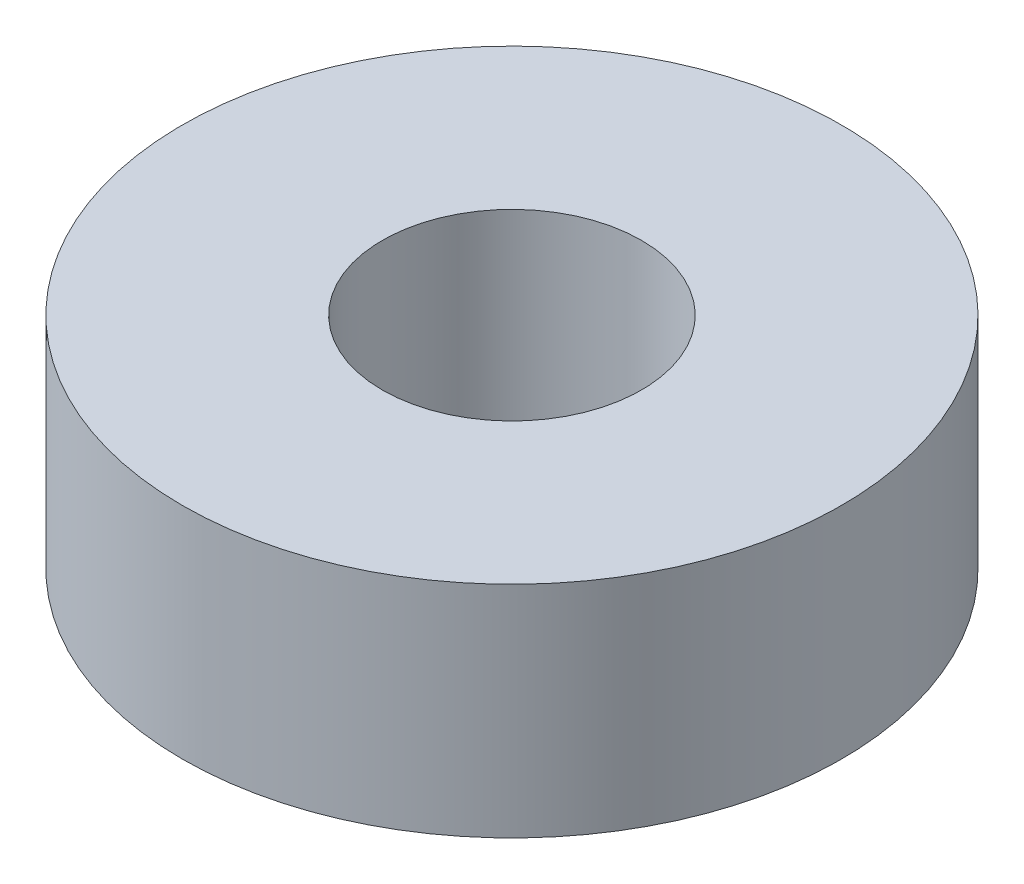
ISO-10303-21;
HEADER;
FILE_DESCRIPTION(('STEP AP214'),'2;1');
FILE_NAME('part.step','',(''),(''),'','','');
FILE_SCHEMA(('AUTOMOTIVE_DESIGN { 1 0 10303 214 1 1 1 1 }'));
ENDSEC;
DATA;
#1=APPLICATION_CONTEXT('core data for automotive mechanical design processes');
#2=APPLICATION_PROTOCOL_DEFINITION('international standard','automotive_design',2000,#1);
#3=PRODUCT_CONTEXT('',#1,'mechanical');
#4=PRODUCT('Part','Part','',(#3));
#5=PRODUCT_RELATED_PRODUCT_CATEGORY('part','',(#4));
#6=PRODUCT_DEFINITION_FORMATION('','',#4);
#7=PRODUCT_DEFINITION_CONTEXT('part definition',#1,'design');
#8=PRODUCT_DEFINITION('design','',#6,#7);
#9=PRODUCT_DEFINITION_SHAPE('','',#8);
#10=(LENGTH_UNIT() NAMED_UNIT(*) SI_UNIT(.MILLI.,.METRE.));
#11=(NAMED_UNIT(*) PLANE_ANGLE_UNIT() SI_UNIT($,.RADIAN.));
#12=(NAMED_UNIT(*) SI_UNIT($,.STERADIAN.) SOLID_ANGLE_UNIT());
#13=UNCERTAINTY_MEASURE_WITH_UNIT(LENGTH_MEASURE(1.E-05),#10,'distance_accuracy_value','');
#14=(GEOMETRIC_REPRESENTATION_CONTEXT(3) GLOBAL_UNCERTAINTY_ASSIGNED_CONTEXT((#13)) GLOBAL_UNIT_ASSIGNED_CONTEXT((#10,
#11,#12)) REPRESENTATION_CONTEXT('',''));
#15=CARTESIAN_POINT('',(0.,0.,0.));
#16=DIRECTION('',(0.,0.,1.));
#17=DIRECTION('',(1.,0.,0.));
#18=AXIS2_PLACEMENT_3D('',#15,#16,#17);
#19=CARTESIAN_POINT('',(0.,5.,0.));
#20=DIRECTION('',(0.,1.,0.));
#21=DIRECTION('',(0.,0.,1.));
#22=AXIS2_PLACEMENT_3D('',#19,#20,#21);
#23=PLANE('',#22);
#24=CARTESIAN_POINT('',(0.,5.,0.));
#25=DIRECTION('',(0.,1.,0.));
#26=DIRECTION('',(0.,0.,1.));
#27=AXIS2_PLACEMENT_3D('',#24,#25,#26);
#28=CIRCLE('',#27,7.5);
#29=CARTESIAN_POINT('',(0.,5.,7.5));
#30=VERTEX_POINT('',#29);
#31=EDGE_CURVE('E10',#30,#30,#28,.T.);
#32=ORIENTED_EDGE('',*,*,#31,.T.);
#33=EDGE_LOOP('',(#32));
#34=FACE_BOUND('',#33,.T.);
#35=CARTESIAN_POINT('',(0.,5.,0.));
#36=DIRECTION('',(0.,1.,0.));
#37=DIRECTION('',(0.,0.,1.));
#38=AXIS2_PLACEMENT_3D('',#35,#36,#37);
#39=CIRCLE('',#38,2.95);
#40=CARTESIAN_POINT('',(0.,5.,2.95));
#41=VERTEX_POINT('',#40);
#42=EDGE_CURVE('E43',#41,#41,#39,.T.);
#43=ORIENTED_EDGE('',*,*,#42,.F.);
#44=EDGE_LOOP('',(#43));
#45=FACE_BOUND('',#44,.T.);
#46=ADVANCED_FACE('F32',(#34,#45),#23,.T.);
#47=CARTESIAN_POINT('',(0.,0.,0.));
#48=DIRECTION('',(0.,1.,0.));
#49=DIRECTION('',(0.,0.,1.));
#50=AXIS2_PLACEMENT_3D('',#47,#48,#49);
#51=PLANE('',#50);
#52=CARTESIAN_POINT('',(0.,0.,0.));
#53=DIRECTION('',(0.,1.,0.));
#54=DIRECTION('',(0.,0.,1.));
#55=AXIS2_PLACEMENT_3D('',#52,#53,#54);
#56=CIRCLE('',#55,7.5);
#57=CARTESIAN_POINT('',(0.,0.,7.5));
#58=VERTEX_POINT('',#57);
#59=EDGE_CURVE('E36',#58,#58,#56,.T.);
#60=ORIENTED_EDGE('',*,*,#59,.F.);
#61=EDGE_LOOP('',(#60));
#62=FACE_BOUND('',#61,.T.);
#63=CARTESIAN_POINT('',(0.,0.,0.));
#64=DIRECTION('',(0.,1.,0.));
#65=DIRECTION('',(0.,0.,1.));
#66=AXIS2_PLACEMENT_3D('',#63,#64,#65);
#67=CIRCLE('',#66,2.95);
#68=CARTESIAN_POINT('',(0.,0.,2.95));
#69=VERTEX_POINT('',#68);
#70=EDGE_CURVE('E45',#69,#69,#67,.T.);
#71=ORIENTED_EDGE('',*,*,#70,.T.);
#72=EDGE_LOOP('',(#71));
#73=FACE_BOUND('',#72,.T.);
#74=ADVANCED_FACE('F55',(#62,#73),#51,.F.);
#75=CARTESIAN_POINT('',(0.,5.,0.));
#76=DIRECTION('',(0.,-1.,0.));
#77=DIRECTION('',(0.,0.,-1.));
#78=AXIS2_PLACEMENT_3D('',#75,#76,#77);
#79=CYLINDRICAL_SURFACE('',#78,7.5);
#80=ORIENTED_EDGE('',*,*,#31,.F.);
#81=EDGE_LOOP('',(#80));
#82=FACE_BOUND('',#81,.T.);
#83=ORIENTED_EDGE('',*,*,#59,.T.);
#84=EDGE_LOOP('',(#83));
#85=FACE_BOUND('',#84,.T.);
#86=ADVANCED_FACE('F34',(#82,#85),#79,.T.);
#87=CARTESIAN_POINT('',(0.,5.,0.));
#88=DIRECTION('',(0.,-1.,0.));
#89=DIRECTION('',(0.,0.,-1.));
#90=AXIS2_PLACEMENT_3D('',#87,#88,#89);
#91=CYLINDRICAL_SURFACE('',#90,2.95);
#92=ORIENTED_EDGE('',*,*,#42,.T.);
#93=EDGE_LOOP('',(#92));
#94=FACE_BOUND('',#93,.T.);
#95=ORIENTED_EDGE('',*,*,#70,.F.);
#96=EDGE_LOOP('',(#95));
#97=FACE_BOUND('',#96,.T.);
#98=ADVANCED_FACE('F51',(#94,#97),#91,.F.);
#99=CLOSED_SHELL('',(#46,#74,#86,#98));
#100=MANIFOLD_SOLID_BREP('B2',#99);
#101=ADVANCED_BREP_SHAPE_REPRESENTATION('',(#18,#100),#14);
#102=SHAPE_DEFINITION_REPRESENTATION(#9,#101);
ENDSEC;
END-ISO-10303-21;
